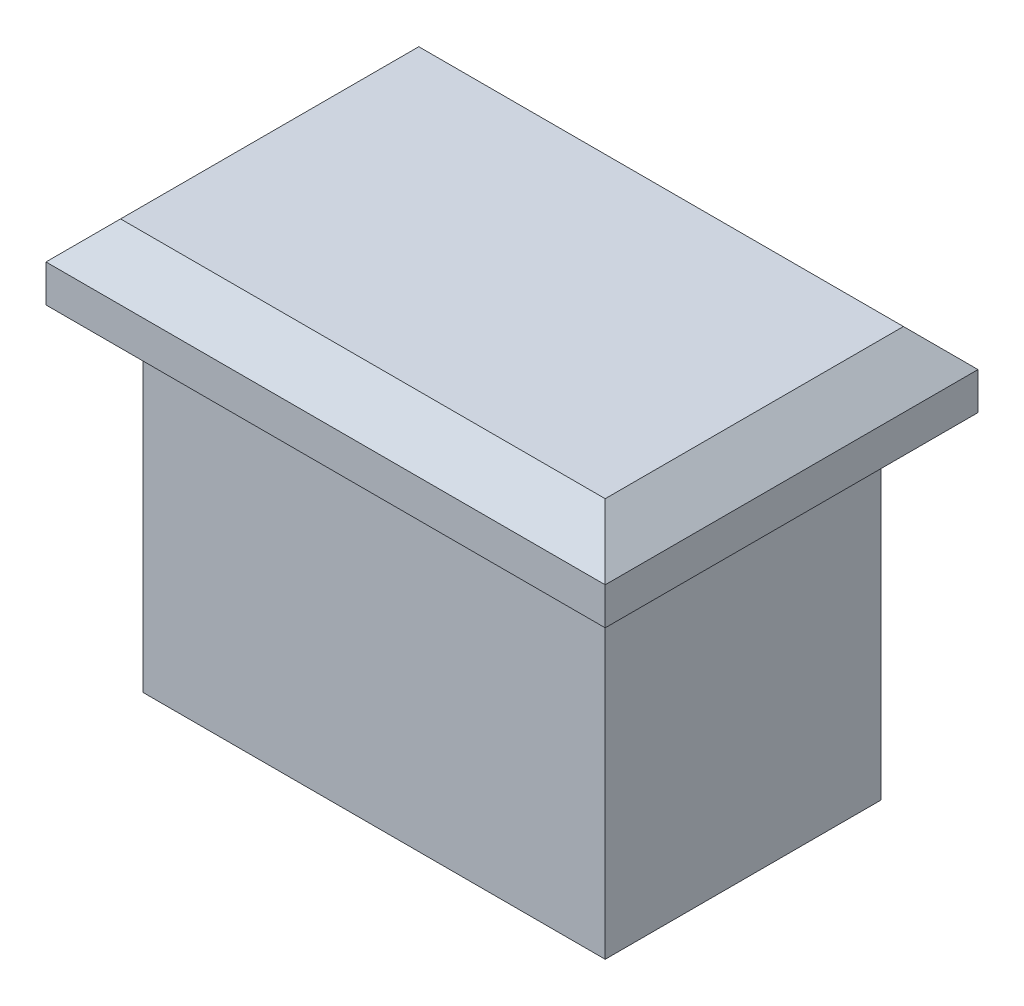
ISO-10303-21;
HEADER;
FILE_DESCRIPTION(('STEP AP214'),'2;1');
FILE_NAME('part.step','',(''),(''),'','','');
FILE_SCHEMA(('AUTOMOTIVE_DESIGN { 1 0 10303 214 1 1 1 1 }'));
ENDSEC;
DATA;
#1=APPLICATION_CONTEXT('core data for automotive mechanical design processes');
#2=APPLICATION_PROTOCOL_DEFINITION('international standard','automotive_design',2000,#1);
#3=PRODUCT_CONTEXT('',#1,'mechanical');
#4=PRODUCT('Part','Part','',(#3));
#5=PRODUCT_RELATED_PRODUCT_CATEGORY('part','',(#4));
#6=PRODUCT_DEFINITION_FORMATION('','',#4);
#7=PRODUCT_DEFINITION_CONTEXT('part definition',#1,'design');
#8=PRODUCT_DEFINITION('design','',#6,#7);
#9=PRODUCT_DEFINITION_SHAPE('','',#8);
#10=(LENGTH_UNIT() NAMED_UNIT(*) SI_UNIT(.MILLI.,.METRE.));
#11=(NAMED_UNIT(*) PLANE_ANGLE_UNIT() SI_UNIT($,.RADIAN.));
#12=(NAMED_UNIT(*) SI_UNIT($,.STERADIAN.) SOLID_ANGLE_UNIT());
#13=UNCERTAINTY_MEASURE_WITH_UNIT(LENGTH_MEASURE(1.E-05),#10,'distance_accuracy_value','');
#14=(GEOMETRIC_REPRESENTATION_CONTEXT(3) GLOBAL_UNCERTAINTY_ASSIGNED_CONTEXT((#13)) GLOBAL_UNIT_ASSIGNED_CONTEXT((#10,
#11,#12)) REPRESENTATION_CONTEXT('',''));
#15=CARTESIAN_POINT('',(0.,0.,0.));
#16=DIRECTION('',(0.,0.,1.));
#17=DIRECTION('',(1.,0.,0.));
#18=AXIS2_PLACEMENT_3D('',#15,#16,#17);
#19=CARTESIAN_POINT('',(0.,0.,0.));
#20=DIRECTION('',(0.,1.,0.));
#21=DIRECTION('',(0.,0.,1.));
#22=AXIS2_PLACEMENT_3D('',#19,#20,#21);
#23=PLANE('',#22);
#24=DIRECTION('',(0.,0.,1.));
#25=VECTOR('',#24,1.);
#26=CARTESIAN_POINT('',(7.5,0.,0.));
#27=LINE('',#26,#25);
#28=CARTESIAN_POINT('',(7.5,0.,-5.));
#29=VERTEX_POINT('',#28);
#30=CARTESIAN_POINT('',(7.5,0.,5.));
#31=VERTEX_POINT('',#30);
#32=EDGE_CURVE('E166',#29,#31,#27,.T.);
#33=ORIENTED_EDGE('',*,*,#32,.T.);
#34=DIRECTION('',(1.,0.,0.));
#35=VECTOR('',#34,1.);
#36=CARTESIAN_POINT('',(0.,0.,5.));
#37=LINE('',#36,#35);
#38=CARTESIAN_POINT('',(-7.5,0.,5.));
#39=VERTEX_POINT('',#38);
#40=EDGE_CURVE('E175',#39,#31,#37,.T.);
#41=ORIENTED_EDGE('',*,*,#40,.F.);
#42=DIRECTION('',(0.,0.,1.));
#43=VECTOR('',#42,1.);
#44=CARTESIAN_POINT('',(-7.5,0.,0.));
#45=LINE('',#44,#43);
#46=CARTESIAN_POINT('',(-7.5,0.,-5.));
#47=VERTEX_POINT('',#46);
#48=EDGE_CURVE('E172',#47,#39,#45,.T.);
#49=ORIENTED_EDGE('',*,*,#48,.F.);
#50=DIRECTION('',(1.,0.,0.));
#51=VECTOR('',#50,1.);
#52=CARTESIAN_POINT('',(0.,0.,-5.));
#53=LINE('',#52,#51);
#54=EDGE_CURVE('E169',#47,#29,#53,.T.);
#55=ORIENTED_EDGE('',*,*,#54,.T.);
#56=EDGE_LOOP('',(#33,#41,#49,#55));
#57=FACE_BOUND('',#56,.T.);
#58=DIRECTION('',(-1.,0.,0.));
#59=VECTOR('',#58,1.);
#60=CARTESIAN_POINT('',(0.,0.,3.7));
#61=LINE('',#60,#59);
#62=CARTESIAN_POINT('',(6.2,0.,3.7));
#63=VERTEX_POINT('',#62);
#64=CARTESIAN_POINT('',(-6.2,0.,3.7));
#65=VERTEX_POINT('',#64);
#66=EDGE_CURVE('E156',#63,#65,#61,.T.);
#67=ORIENTED_EDGE('',*,*,#66,.F.);
#68=DIRECTION('',(0.,0.,1.));
#69=VECTOR('',#68,1.);
#70=CARTESIAN_POINT('',(6.2,0.,0.));
#71=LINE('',#70,#69);
#72=CARTESIAN_POINT('',(6.2,0.,-3.7));
#73=VERTEX_POINT('',#72);
#74=EDGE_CURVE('E152',#73,#63,#71,.T.);
#75=ORIENTED_EDGE('',*,*,#74,.F.);
#76=DIRECTION('',(1.,0.,0.));
#77=VECTOR('',#76,1.);
#78=CARTESIAN_POINT('',(0.,0.,-3.7));
#79=LINE('',#78,#77);
#80=CARTESIAN_POINT('',(-6.2,0.,-3.7));
#81=VERTEX_POINT('',#80);
#82=EDGE_CURVE('E136',#81,#73,#79,.T.);
#83=ORIENTED_EDGE('',*,*,#82,.F.);
#84=DIRECTION('',(0.,0.,-1.));
#85=VECTOR('',#84,1.);
#86=CARTESIAN_POINT('',(-6.2,0.,0.));
#87=LINE('',#86,#85);
#88=EDGE_CURVE('E149',#65,#81,#87,.T.);
#89=ORIENTED_EDGE('',*,*,#88,.F.);
#90=EDGE_LOOP('',(#67,#75,#83,#89));
#91=FACE_BOUND('',#90,.T.);
#92=ADVANCED_FACE('F41',(#57,#91),#23,.F.);
#93=CARTESIAN_POINT('',(7.5,2.,0.));
#94=DIRECTION('',(1.,0.,0.));
#95=DIRECTION('',(0.,0.,-1.));
#96=AXIS2_PLACEMENT_3D('',#93,#94,#95);
#97=PLANE('',#96);
#98=DIRECTION('',(0.,-1.,0.));
#99=VECTOR('',#98,1.);
#100=CARTESIAN_POINT('',(7.5,2.,-5.));
#101=LINE('',#100,#99);
#102=CARTESIAN_POINT('',(7.5,1.,-5.));
#103=VERTEX_POINT('',#102);
#104=EDGE_CURVE('E184',#103,#29,#101,.T.);
#105=ORIENTED_EDGE('',*,*,#104,.F.);
#106=DIRECTION('',(0.,0.,1.));
#107=VECTOR('',#106,1.);
#108=CARTESIAN_POINT('',(7.5,1.,0.));
#109=LINE('',#108,#107);
#110=CARTESIAN_POINT('',(7.5,1.,5.));
#111=VERTEX_POINT('',#110);
#112=EDGE_CURVE('E11',#103,#111,#109,.T.);
#113=ORIENTED_EDGE('',*,*,#112,.T.);
#114=DIRECTION('',(0.,-1.,0.));
#115=VECTOR('',#114,1.);
#116=CARTESIAN_POINT('',(7.5,2.,5.));
#117=LINE('',#116,#115);
#118=EDGE_CURVE('E178',#111,#31,#117,.T.);
#119=ORIENTED_EDGE('',*,*,#118,.T.);
#120=ORIENTED_EDGE('',*,*,#32,.F.);
#121=EDGE_LOOP('',(#105,#113,#119,#120));
#122=FACE_BOUND('',#121,.T.);
#123=ADVANCED_FACE('F247',(#122),#97,.T.);
#124=CARTESIAN_POINT('',(0.,2.,-5.));
#125=DIRECTION('',(0.,0.,-1.));
#126=DIRECTION('',(-1.,0.,0.));
#127=AXIS2_PLACEMENT_3D('',#124,#125,#126);
#128=PLANE('',#127);
#129=DIRECTION('',(0.,-1.,0.));
#130=VECTOR('',#129,1.);
#131=CARTESIAN_POINT('',(-7.5,2.,-5.));
#132=LINE('',#131,#130);
#133=CARTESIAN_POINT('',(-7.5,1.,-5.));
#134=VERTEX_POINT('',#133);
#135=EDGE_CURVE('E182',#134,#47,#132,.T.);
#136=ORIENTED_EDGE('',*,*,#135,.F.);
#137=DIRECTION('',(1.,0.,0.));
#138=VECTOR('',#137,1.);
#139=CARTESIAN_POINT('',(0.,1.,-5.));
#140=LINE('',#139,#138);
#141=EDGE_CURVE('E51',#134,#103,#140,.T.);
#142=ORIENTED_EDGE('',*,*,#141,.T.);
#143=ORIENTED_EDGE('',*,*,#104,.T.);
#144=ORIENTED_EDGE('',*,*,#54,.F.);
#145=EDGE_LOOP('',(#136,#142,#143,#144));
#146=FACE_BOUND('',#145,.T.);
#147=ADVANCED_FACE('F276',(#146),#128,.T.);
#148=CARTESIAN_POINT('',(-7.5,2.,0.));
#149=DIRECTION('',(1.,0.,0.));
#150=DIRECTION('',(0.,0.,-1.));
#151=AXIS2_PLACEMENT_3D('',#148,#149,#150);
#152=PLANE('',#151);
#153=DIRECTION('',(0.,-1.,0.));
#154=VECTOR('',#153,1.);
#155=CARTESIAN_POINT('',(-7.5,2.,5.));
#156=LINE('',#155,#154);
#157=CARTESIAN_POINT('',(-7.5,1.,5.));
#158=VERTEX_POINT('',#157);
#159=EDGE_CURVE('E180',#158,#39,#156,.T.);
#160=ORIENTED_EDGE('',*,*,#159,.F.);
#161=DIRECTION('',(0.,0.,-1.));
#162=VECTOR('',#161,1.);
#163=CARTESIAN_POINT('',(-7.5,1.,-5.));
#164=LINE('',#163,#162);
#165=EDGE_CURVE('E66',#158,#134,#164,.T.);
#166=ORIENTED_EDGE('',*,*,#165,.T.);
#167=ORIENTED_EDGE('',*,*,#135,.T.);
#168=ORIENTED_EDGE('',*,*,#48,.T.);
#169=EDGE_LOOP('',(#160,#166,#167,#168));
#170=FACE_BOUND('',#169,.T.);
#171=ADVANCED_FACE('F268',(#170),#152,.F.);
#172=CARTESIAN_POINT('',(0.,2.,5.));
#173=DIRECTION('',(0.,0.,-1.));
#174=DIRECTION('',(-1.,0.,0.));
#175=AXIS2_PLACEMENT_3D('',#172,#173,#174);
#176=PLANE('',#175);
#177=ORIENTED_EDGE('',*,*,#118,.F.);
#178=DIRECTION('',(-1.,0.,0.));
#179=VECTOR('',#178,1.);
#180=CARTESIAN_POINT('',(-7.5,1.,5.));
#181=LINE('',#180,#179);
#182=EDGE_CURVE('E221',#111,#158,#181,.T.);
#183=ORIENTED_EDGE('',*,*,#182,.T.);
#184=ORIENTED_EDGE('',*,*,#159,.T.);
#185=ORIENTED_EDGE('',*,*,#40,.T.);
#186=EDGE_LOOP('',(#177,#183,#184,#185));
#187=FACE_BOUND('',#186,.T.);
#188=ADVANCED_FACE('F251',(#187),#176,.F.);
#189=CARTESIAN_POINT('',(0.,2.,0.));
#190=DIRECTION('',(0.,1.,0.));
#191=DIRECTION('',(0.,0.,1.));
#192=AXIS2_PLACEMENT_3D('',#189,#190,#191);
#193=PLANE('',#192);
#194=DIRECTION('',(0.,0.,1.));
#195=VECTOR('',#194,1.);
#196=CARTESIAN_POINT('',(-6.49999999999999,2.,5.));
#197=LINE('',#196,#195);
#198=CARTESIAN_POINT('',(-6.5,2.,-4.));
#199=VERTEX_POINT('',#198);
#200=CARTESIAN_POINT('',(-6.49999999999999,2.,3.99999999999999));
#201=VERTEX_POINT('',#200);
#202=EDGE_CURVE('E216',#199,#201,#197,.T.);
#203=ORIENTED_EDGE('',*,*,#202,.T.);
#204=DIRECTION('',(1.,0.,0.));
#205=VECTOR('',#204,1.);
#206=CARTESIAN_POINT('',(7.5,2.,4.));
#207=LINE('',#206,#205);
#208=CARTESIAN_POINT('',(6.5,2.,4.));
#209=VERTEX_POINT('',#208);
#210=EDGE_CURVE('E218',#201,#209,#207,.T.);
#211=ORIENTED_EDGE('',*,*,#210,.T.);
#212=DIRECTION('',(0.,0.,-1.));
#213=VECTOR('',#212,1.);
#214=CARTESIAN_POINT('',(6.5,2.,0.));
#215=LINE('',#214,#213);
#216=CARTESIAN_POINT('',(6.5,2.,-4.));
#217=VERTEX_POINT('',#216);
#218=EDGE_CURVE('E203',#209,#217,#215,.T.);
#219=ORIENTED_EDGE('',*,*,#218,.T.);
#220=DIRECTION('',(-1.,0.,0.));
#221=VECTOR('',#220,1.);
#222=CARTESIAN_POINT('',(0.,2.,-4.));
#223=LINE('',#222,#221);
#224=EDGE_CURVE('E214',#217,#199,#223,.T.);
#225=ORIENTED_EDGE('',*,*,#224,.T.);
#226=EDGE_LOOP('',(#203,#211,#219,#225));
#227=FACE_BOUND('',#226,.T.);
#228=ADVANCED_FACE('F257',(#227),#193,.T.);
#229=CARTESIAN_POINT('',(0.,-10.,3.7));
#230=DIRECTION('',(0.,0.,-1.));
#231=DIRECTION('',(-1.,0.,0.));
#232=AXIS2_PLACEMENT_3D('',#229,#230,#231);
#233=PLANE('',#232);
#234=DIRECTION('',(0.,1.,0.));
#235=VECTOR('',#234,1.);
#236=CARTESIAN_POINT('',(-6.2,-10.,3.7));
#237=LINE('',#236,#235);
#238=CARTESIAN_POINT('',(-6.2,-9.,3.7));
#239=VERTEX_POINT('',#238);
#240=EDGE_CURVE('E142',#239,#65,#237,.T.);
#241=ORIENTED_EDGE('',*,*,#240,.F.);
#242=DIRECTION('',(1.,0.,0.));
#243=VECTOR('',#242,1.);
#244=CARTESIAN_POINT('',(6.2,-9.,3.7));
#245=LINE('',#244,#243);
#246=CARTESIAN_POINT('',(6.2,-9.,3.7));
#247=VERTEX_POINT('',#246);
#248=EDGE_CURVE('E201',#239,#247,#245,.T.);
#249=ORIENTED_EDGE('',*,*,#248,.T.);
#250=DIRECTION('',(0.,1.,0.));
#251=VECTOR('',#250,1.);
#252=CARTESIAN_POINT('',(6.2,-10.,3.7));
#253=LINE('',#252,#251);
#254=EDGE_CURVE('E162',#247,#63,#253,.T.);
#255=ORIENTED_EDGE('',*,*,#254,.T.);
#256=ORIENTED_EDGE('',*,*,#66,.T.);
#257=EDGE_LOOP('',(#241,#249,#255,#256));
#258=FACE_BOUND('',#257,.T.);
#259=ADVANCED_FACE('F259',(#258),#233,.F.);
#260=CARTESIAN_POINT('',(-6.2,-10.,0.));
#261=DIRECTION('',(1.,0.,0.));
#262=DIRECTION('',(0.,0.,-1.));
#263=AXIS2_PLACEMENT_3D('',#260,#261,#262);
#264=PLANE('',#263);
#265=DIRECTION('',(0.,1.,0.));
#266=VECTOR('',#265,1.);
#267=CARTESIAN_POINT('',(-6.2,-10.,-3.7));
#268=LINE('',#267,#266);
#269=CARTESIAN_POINT('',(-6.2,-9.,-3.7));
#270=VERTEX_POINT('',#269);
#271=EDGE_CURVE('E132',#270,#81,#268,.T.);
#272=ORIENTED_EDGE('',*,*,#271,.F.);
#273=DIRECTION('',(0.,0.,1.));
#274=VECTOR('',#273,1.);
#275=CARTESIAN_POINT('',(-6.2,-9.,3.7));
#276=LINE('',#275,#274);
#277=EDGE_CURVE('E199',#270,#239,#276,.T.);
#278=ORIENTED_EDGE('',*,*,#277,.T.);
#279=ORIENTED_EDGE('',*,*,#240,.T.);
#280=ORIENTED_EDGE('',*,*,#88,.T.);
#281=EDGE_LOOP('',(#272,#278,#279,#280));
#282=FACE_BOUND('',#281,.T.);
#283=ADVANCED_FACE('F154',(#282),#264,.F.);
#284=CARTESIAN_POINT('',(0.,-10.,-3.7));
#285=DIRECTION('',(0.,0.,1.));
#286=DIRECTION('',(1.,0.,0.));
#287=AXIS2_PLACEMENT_3D('',#284,#285,#286);
#288=PLANE('',#287);
#289=DIRECTION('',(0.,1.,0.));
#290=VECTOR('',#289,1.);
#291=CARTESIAN_POINT('',(6.2,-10.,-3.7));
#292=LINE('',#291,#290);
#293=CARTESIAN_POINT('',(6.2,-9.,-3.7));
#294=VERTEX_POINT('',#293);
#295=EDGE_CURVE('E143',#294,#73,#292,.T.);
#296=ORIENTED_EDGE('',*,*,#295,.F.);
#297=DIRECTION('',(-1.,0.,0.));
#298=VECTOR('',#297,1.);
#299=CARTESIAN_POINT('',(-6.2,-9.,-3.7));
#300=LINE('',#299,#298);
#301=EDGE_CURVE('E138',#294,#270,#300,.T.);
#302=ORIENTED_EDGE('',*,*,#301,.T.);
#303=ORIENTED_EDGE('',*,*,#271,.T.);
#304=ORIENTED_EDGE('',*,*,#82,.T.);
#305=EDGE_LOOP('',(#296,#302,#303,#304));
#306=FACE_BOUND('',#305,.T.);
#307=ADVANCED_FACE('F135',(#306),#288,.F.);
#308=CARTESIAN_POINT('',(6.2,-10.,0.));
#309=DIRECTION('',(-1.,0.,0.));
#310=DIRECTION('',(0.,0.,1.));
#311=AXIS2_PLACEMENT_3D('',#308,#309,#310);
#312=PLANE('',#311);
#313=ORIENTED_EDGE('',*,*,#254,.F.);
#314=DIRECTION('',(0.,0.,-1.));
#315=VECTOR('',#314,1.);
#316=CARTESIAN_POINT('',(6.2,-9.,-3.7));
#317=LINE('',#316,#315);
#318=EDGE_CURVE('E195',#247,#294,#317,.T.);
#319=ORIENTED_EDGE('',*,*,#318,.T.);
#320=ORIENTED_EDGE('',*,*,#295,.T.);
#321=ORIENTED_EDGE('',*,*,#74,.T.);
#322=EDGE_LOOP('',(#313,#319,#320,#321));
#323=FACE_BOUND('',#322,.T.);
#324=ADVANCED_FACE('F362',(#323),#312,.F.);
#325=CARTESIAN_POINT('',(0.,-10.,0.));
#326=DIRECTION('',(0.,-1.,0.));
#327=DIRECTION('',(0.,0.,-1.));
#328=AXIS2_PLACEMENT_3D('',#325,#326,#327);
#329=PLANE('',#328);
#330=DIRECTION('',(1.,0.,0.));
#331=VECTOR('',#330,1.);
#332=CARTESIAN_POINT('',(6.2,-10.,-2.7));
#333=LINE('',#332,#331);
#334=CARTESIAN_POINT('',(-5.2,-10.,-2.7));
#335=VERTEX_POINT('',#334);
#336=CARTESIAN_POINT('',(5.2,-10.,-2.7));
#337=VERTEX_POINT('',#336);
#338=EDGE_CURVE('E190',#335,#337,#333,.T.);
#339=ORIENTED_EDGE('',*,*,#338,.T.);
#340=DIRECTION('',(0.,0.,1.));
#341=VECTOR('',#340,1.);
#342=CARTESIAN_POINT('',(5.2,-10.,3.7));
#343=LINE('',#342,#341);
#344=CARTESIAN_POINT('',(5.2,-10.,2.7));
#345=VERTEX_POINT('',#344);
#346=EDGE_CURVE('E192',#337,#345,#343,.T.);
#347=ORIENTED_EDGE('',*,*,#346,.T.);
#348=DIRECTION('',(-1.,0.,0.));
#349=VECTOR('',#348,1.);
#350=CARTESIAN_POINT('',(-6.2,-10.,2.7));
#351=LINE('',#350,#349);
#352=CARTESIAN_POINT('',(-5.2,-10.,2.7));
#353=VERTEX_POINT('',#352);
#354=EDGE_CURVE('E186',#345,#353,#351,.T.);
#355=ORIENTED_EDGE('',*,*,#354,.T.);
#356=DIRECTION('',(0.,0.,-1.));
#357=VECTOR('',#356,1.);
#358=CARTESIAN_POINT('',(-5.2,-10.,-3.7));
#359=LINE('',#358,#357);
#360=EDGE_CURVE('E188',#353,#335,#359,.T.);
#361=ORIENTED_EDGE('',*,*,#360,.T.);
#362=EDGE_LOOP('',(#339,#347,#355,#361));
#363=FACE_BOUND('',#362,.T.);
#364=ADVANCED_FACE('F310',(#363),#329,.T.);
#365=CARTESIAN_POINT('',(-5.2,-10.,0.));
#366=DIRECTION('',(-0.70710678118655,-0.707106781186545,0.));
#367=DIRECTION('',(0.,0.,1.));
#368=AXIS2_PLACEMENT_3D('',#365,#366,#367);
#369=PLANE('',#368);
#370=DIRECTION('',(0.577350269189625,-0.577350269189629,-0.577350269189625));
#371=VECTOR('',#370,1.);
#372=CARTESIAN_POINT('',(-3.46666666666668,-11.7333333333333,0.966666666666675));
#373=LINE('',#372,#371);
#374=EDGE_CURVE('E208',#239,#353,#373,.T.);
#375=ORIENTED_EDGE('',*,*,#374,.F.);
#376=ORIENTED_EDGE('',*,*,#277,.F.);
#377=DIRECTION('',(0.577350269189625,-0.577350269189629,0.577350269189625));
#378=VECTOR('',#377,1.);
#379=CARTESIAN_POINT('',(-4.30000000000001,-10.9,-1.80000000000001));
#380=LINE('',#379,#378);
#381=EDGE_CURVE('E158',#335,#270,#380,.F.);
#382=ORIENTED_EDGE('',*,*,#381,.F.);
#383=ORIENTED_EDGE('',*,*,#360,.F.);
#384=EDGE_LOOP('',(#375,#376,#382,#383));
#385=FACE_BOUND('',#384,.T.);
#386=ADVANCED_FACE('F304',(#385),#369,.T.);
#387=CARTESIAN_POINT('',(0.,-10.,-2.7));
#388=DIRECTION('',(0.,-0.707106781186545,-0.70710678118655));
#389=DIRECTION('',(-1.,0.,0.));
#390=AXIS2_PLACEMENT_3D('',#387,#388,#389);
#391=PLANE('',#390);
#392=ORIENTED_EDGE('',*,*,#381,.T.);
#393=ORIENTED_EDGE('',*,*,#301,.F.);
#394=DIRECTION('',(-0.577350269189625,-0.577350269189629,0.577350269189625));
#395=VECTOR('',#394,1.);
#396=CARTESIAN_POINT('',(3.46666666666668,-11.7333333333333,-0.966666666666678));
#397=LINE('',#396,#395);
#398=EDGE_CURVE('E206',#337,#294,#397,.F.);
#399=ORIENTED_EDGE('',*,*,#398,.F.);
#400=ORIENTED_EDGE('',*,*,#338,.F.);
#401=EDGE_LOOP('',(#392,#393,#399,#400));
#402=FACE_BOUND('',#401,.T.);
#403=ADVANCED_FACE('F297',(#402),#391,.T.);
#404=CARTESIAN_POINT('',(0.,-10.,2.7));
#405=DIRECTION('',(0.,-0.707106781186545,0.70710678118655));
#406=DIRECTION('',(1.,0.,0.));
#407=AXIS2_PLACEMENT_3D('',#404,#405,#406);
#408=PLANE('',#407);
#409=ORIENTED_EDGE('',*,*,#374,.T.);
#410=ORIENTED_EDGE('',*,*,#354,.F.);
#411=DIRECTION('',(0.577350269189624,0.577350269189629,0.577350269189625));
#412=VECTOR('',#411,1.);
#413=CARTESIAN_POINT('',(3.46666666666668,-11.7333333333333,0.966666666666676));
#414=LINE('',#413,#412);
#415=EDGE_CURVE('E204',#247,#345,#414,.F.);
#416=ORIENTED_EDGE('',*,*,#415,.F.);
#417=ORIENTED_EDGE('',*,*,#248,.F.);
#418=EDGE_LOOP('',(#409,#410,#416,#417));
#419=FACE_BOUND('',#418,.T.);
#420=ADVANCED_FACE('F290',(#419),#408,.T.);
#421=CARTESIAN_POINT('',(5.2,-10.,0.));
#422=DIRECTION('',(0.70710678118655,-0.707106781186545,0.));
#423=DIRECTION('',(0.,0.,-1.));
#424=AXIS2_PLACEMENT_3D('',#421,#422,#423);
#425=PLANE('',#424);
#426=ORIENTED_EDGE('',*,*,#398,.T.);
#427=ORIENTED_EDGE('',*,*,#318,.F.);
#428=ORIENTED_EDGE('',*,*,#415,.T.);
#429=ORIENTED_EDGE('',*,*,#346,.F.);
#430=EDGE_LOOP('',(#426,#427,#428,#429));
#431=FACE_BOUND('',#430,.T.);
#432=ADVANCED_FACE('F284',(#431),#425,.T.);
#433=CARTESIAN_POINT('',(0.,1.,-5.));
#434=DIRECTION('',(0.,-0.70710678118655,0.707106781186545));
#435=DIRECTION('',(1.,0.,0.));
#436=AXIS2_PLACEMENT_3D('',#433,#434,#435);
#437=PLANE('',#436);
#438=DIRECTION('',(-0.577350269189627,0.577350269189623,0.577350269189627));
#439=VECTOR('',#438,1.);
#440=CARTESIAN_POINT('',(5.83333333333333,2.66666666666667,-3.33333333333333));
#441=LINE('',#440,#439);
#442=EDGE_CURVE('E229',#103,#217,#441,.T.);
#443=ORIENTED_EDGE('',*,*,#442,.F.);
#444=ORIENTED_EDGE('',*,*,#141,.F.);
#445=DIRECTION('',(-0.577350269189627,-0.577350269189623,-0.577350269189627));
#446=VECTOR('',#445,1.);
#447=CARTESIAN_POINT('',(-4.99999999999999,3.5,-2.49999999999999));
#448=LINE('',#447,#446);
#449=EDGE_CURVE('E46',#199,#134,#448,.T.);
#450=ORIENTED_EDGE('',*,*,#449,.F.);
#451=ORIENTED_EDGE('',*,*,#224,.F.);
#452=EDGE_LOOP('',(#443,#444,#450,#451));
#453=FACE_BOUND('',#452,.T.);
#454=ADVANCED_FACE('F44',(#453),#437,.F.);
#455=CARTESIAN_POINT('',(-6.49999999999999,2.,0.));
#456=DIRECTION('',(-0.707106781186545,0.70710678118655,0.));
#457=DIRECTION('',(0.,0.,-1.));
#458=AXIS2_PLACEMENT_3D('',#455,#456,#457);
#459=PLANE('',#458);
#460=ORIENTED_EDGE('',*,*,#449,.T.);
#461=ORIENTED_EDGE('',*,*,#165,.F.);
#462=DIRECTION('',(0.577350269189627,0.577350269189623,-0.577350269189627));
#463=VECTOR('',#462,1.);
#464=CARTESIAN_POINT('',(-5.16666666666666,3.33333333333333,2.66666666666666));
#465=LINE('',#464,#463);
#466=EDGE_CURVE('E228',#201,#158,#465,.F.);
#467=ORIENTED_EDGE('',*,*,#466,.F.);
#468=ORIENTED_EDGE('',*,*,#202,.F.);
#469=EDGE_LOOP('',(#460,#461,#467,#468));
#470=FACE_BOUND('',#469,.T.);
#471=ADVANCED_FACE('F239',(#470),#459,.T.);
#472=CARTESIAN_POINT('',(7.5,1.,0.));
#473=DIRECTION('',(-0.707106781186545,-0.70710678118655,0.));
#474=DIRECTION('',(0.,0.,1.));
#475=AXIS2_PLACEMENT_3D('',#472,#473,#474);
#476=PLANE('',#475);
#477=ORIENTED_EDGE('',*,*,#442,.T.);
#478=ORIENTED_EDGE('',*,*,#218,.F.);
#479=DIRECTION('',(-0.577350269189627,0.577350269189623,-0.577350269189627));
#480=VECTOR('',#479,1.);
#481=CARTESIAN_POINT('',(5.83333333333333,2.66666666666667,3.33333333333333));
#482=LINE('',#481,#480);
#483=EDGE_CURVE('E226',#111,#209,#482,.T.);
#484=ORIENTED_EDGE('',*,*,#483,.F.);
#485=ORIENTED_EDGE('',*,*,#112,.F.);
#486=EDGE_LOOP('',(#477,#478,#484,#485));
#487=FACE_BOUND('',#486,.T.);
#488=ADVANCED_FACE('F244',(#487),#476,.F.);
#489=CARTESIAN_POINT('',(0.,2.,3.99999999999999));
#490=DIRECTION('',(0.,0.70710678118655,0.707106781186545));
#491=DIRECTION('',(-1.,0.,0.));
#492=AXIS2_PLACEMENT_3D('',#489,#490,#491);
#493=PLANE('',#492);
#494=ORIENTED_EDGE('',*,*,#466,.T.);
#495=ORIENTED_EDGE('',*,*,#182,.F.);
#496=ORIENTED_EDGE('',*,*,#483,.T.);
#497=ORIENTED_EDGE('',*,*,#210,.F.);
#498=EDGE_LOOP('',(#494,#495,#496,#497));
#499=FACE_BOUND('',#498,.T.);
#500=ADVANCED_FACE('F254',(#499),#493,.T.);
#501=CLOSED_SHELL('',(#92,#123,#147,#171,#188,#228,#259,#283,#307,#324,#364,#386,#403,#420,#432,
#454,#471,#488,#500));
#502=MANIFOLD_SOLID_BREP('B2',#501);
#503=ADVANCED_BREP_SHAPE_REPRESENTATION('',(#18,#502),#14);
#504=SHAPE_DEFINITION_REPRESENTATION(#9,#503);
ENDSEC;
END-ISO-10303-21;
